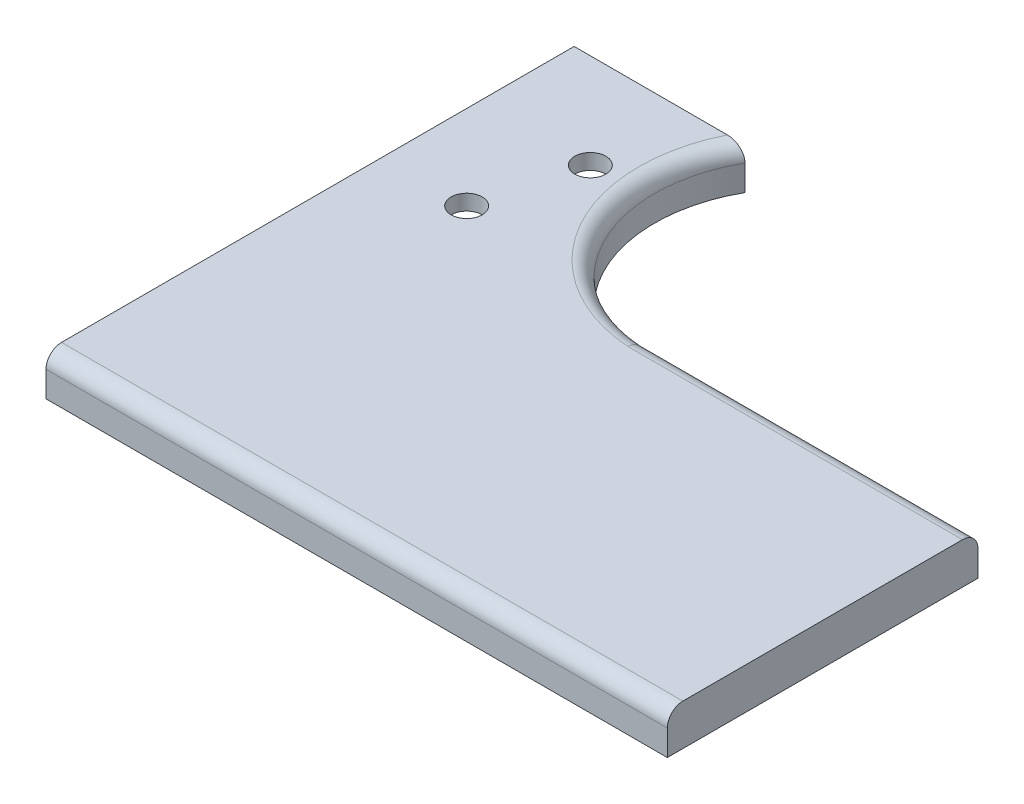
ISO-10303-21;
HEADER;
FILE_DESCRIPTION(('STEP AP214'),'2;1');
FILE_NAME('part.step','',(''),(''),'','','');
FILE_SCHEMA(('AUTOMOTIVE_DESIGN { 1 0 10303 214 1 1 1 1 }'));
ENDSEC;
DATA;
#1=APPLICATION_CONTEXT('core data for automotive mechanical design processes');
#2=APPLICATION_PROTOCOL_DEFINITION('international standard','automotive_design',2000,#1);
#3=PRODUCT_CONTEXT('',#1,'mechanical');
#4=PRODUCT('Part','Part','',(#3));
#5=PRODUCT_RELATED_PRODUCT_CATEGORY('part','',(#4));
#6=PRODUCT_DEFINITION_FORMATION('','',#4);
#7=PRODUCT_DEFINITION_CONTEXT('part definition',#1,'design');
#8=PRODUCT_DEFINITION('design','',#6,#7);
#9=PRODUCT_DEFINITION_SHAPE('','',#8);
#10=(LENGTH_UNIT() NAMED_UNIT(*) SI_UNIT(.MILLI.,.METRE.));
#11=(NAMED_UNIT(*) PLANE_ANGLE_UNIT() SI_UNIT($,.RADIAN.));
#12=(NAMED_UNIT(*) SI_UNIT($,.STERADIAN.) SOLID_ANGLE_UNIT());
#13=UNCERTAINTY_MEASURE_WITH_UNIT(LENGTH_MEASURE(1.E-05),#10,'distance_accuracy_value','');
#14=(GEOMETRIC_REPRESENTATION_CONTEXT(3) GLOBAL_UNCERTAINTY_ASSIGNED_CONTEXT((#13)) GLOBAL_UNIT_ASSIGNED_CONTEXT((#10,
#11,#12)) REPRESENTATION_CONTEXT('',''));
#15=CARTESIAN_POINT('',(0.,0.,0.));
#16=DIRECTION('',(0.,0.,1.));
#17=DIRECTION('',(1.,0.,0.));
#18=AXIS2_PLACEMENT_3D('',#15,#16,#17);
#19=CARTESIAN_POINT('',(20.,2.8,10.));
#20=DIRECTION('',(-1.,0.,0.));
#21=DIRECTION('',(0.,0.,1.));
#22=AXIS2_PLACEMENT_3D('',#19,#20,#21);
#23=PLANE('',#22);
#24=DIRECTION('',(0.,0.,-1.));
#25=VECTOR('',#24,1.);
#26=CARTESIAN_POINT('',(20.,2.8,10.));
#27=LINE('',#26,#25);
#28=CARTESIAN_POINT('',(20.,2.8,9.));
#29=VERTEX_POINT('',#28);
#30=CARTESIAN_POINT('',(20.,2.8,-9.));
#31=VERTEX_POINT('',#30);
#32=EDGE_CURVE('E192',#29,#31,#27,.T.);
#33=ORIENTED_EDGE('',*,*,#32,.F.);
#34=CARTESIAN_POINT('',(20.,1.8,9.));
#35=DIRECTION('',(-1.,0.,0.));
#36=DIRECTION('',(0.,0.,1.));
#37=AXIS2_PLACEMENT_3D('',#34,#35,#36);
#38=CIRCLE('',#37,1.);
#39=CARTESIAN_POINT('',(20.,1.8,10.));
#40=VERTEX_POINT('',#39);
#41=EDGE_CURVE('E64',#29,#40,#38,.F.);
#42=ORIENTED_EDGE('',*,*,#41,.T.);
#43=DIRECTION('',(0.,-1.,0.));
#44=VECTOR('',#43,1.);
#45=CARTESIAN_POINT('',(20.,2.8,10.));
#46=LINE('',#45,#44);
#47=CARTESIAN_POINT('',(20.,0.15,10.));
#48=VERTEX_POINT('',#47);
#49=EDGE_CURVE('E205',#40,#48,#46,.T.);
#50=ORIENTED_EDGE('',*,*,#49,.T.);
#51=DIRECTION('',(0.,0.,1.));
#52=VECTOR('',#51,1.);
#53=CARTESIAN_POINT('',(20.,0.15,10.));
#54=LINE('',#53,#52);
#55=CARTESIAN_POINT('',(20.,0.15,-10.));
#56=VERTEX_POINT('',#55);
#57=EDGE_CURVE('E449',#56,#48,#54,.T.);
#58=ORIENTED_EDGE('',*,*,#57,.F.);
#59=DIRECTION('',(0.,-1.,0.));
#60=VECTOR('',#59,1.);
#61=CARTESIAN_POINT('',(20.,2.8,-10.));
#62=LINE('',#61,#60);
#63=CARTESIAN_POINT('',(20.,1.8,-10.));
#64=VERTEX_POINT('',#63);
#65=EDGE_CURVE('E154',#64,#56,#62,.T.);
#66=ORIENTED_EDGE('',*,*,#65,.F.);
#67=CARTESIAN_POINT('',(20.,1.8,-9.));
#68=DIRECTION('',(-1.,0.,0.));
#69=DIRECTION('',(0.,0.,1.));
#70=AXIS2_PLACEMENT_3D('',#67,#68,#69);
#71=CIRCLE('',#70,1.);
#72=EDGE_CURVE('E251',#64,#31,#71,.F.);
#73=ORIENTED_EDGE('',*,*,#72,.T.);
#74=EDGE_LOOP('',(#33,#42,#50,#58,#66,#73));
#75=FACE_BOUND('',#74,.T.);
#76=ADVANCED_FACE('F39',(#75),#23,.F.);
#77=CARTESIAN_POINT('',(20.,2.8,-10.));
#78=DIRECTION('',(0.,0.,1.));
#79=DIRECTION('',(1.,0.,0.));
#80=AXIS2_PLACEMENT_3D('',#77,#78,#79);
#81=PLANE('',#80);
#82=DIRECTION('',(0.,-1.,0.));
#83=VECTOR('',#82,1.);
#84=CARTESIAN_POINT('',(-1.50000000000001,2.8,-10.));
#85=LINE('',#84,#83);
#86=CARTESIAN_POINT('',(-1.50000000000001,1.8,-10.));
#87=VERTEX_POINT('',#86);
#88=CARTESIAN_POINT('',(-1.50000000000001,0.15,-10.));
#89=VERTEX_POINT('',#88);
#90=EDGE_CURVE('E214',#87,#89,#85,.T.);
#91=ORIENTED_EDGE('',*,*,#90,.F.);
#92=DIRECTION('',(-1.,0.,0.));
#93=VECTOR('',#92,1.);
#94=CARTESIAN_POINT('',(20.,1.8,-10.));
#95=LINE('',#94,#93);
#96=EDGE_CURVE('E270',#87,#64,#95,.F.);
#97=ORIENTED_EDGE('',*,*,#96,.T.);
#98=ORIENTED_EDGE('',*,*,#65,.T.);
#99=DIRECTION('',(1.,0.,0.));
#100=VECTOR('',#99,1.);
#101=CARTESIAN_POINT('',(20.,0.15,-10.));
#102=LINE('',#101,#100);
#103=EDGE_CURVE('E448',#89,#56,#102,.T.);
#104=ORIENTED_EDGE('',*,*,#103,.F.);
#105=EDGE_LOOP('',(#91,#97,#98,#104));
#106=FACE_BOUND('',#105,.T.);
#107=ADVANCED_FACE('F245',(#106),#81,.F.);
#108=CARTESIAN_POINT('',(-0.800001347423966,2.8,-19.3839278495943));
#109=DIRECTION('',(0.,-1.,0.));
#110=DIRECTION('',(0.,0.,-1.));
#111=AXIS2_PLACEMENT_3D('',#108,#109,#110);
#112=CYLINDRICAL_SURFACE('',#111,9.41);
#113=DIRECTION('',(0.,-1.,0.));
#114=VECTOR('',#113,1.);
#115=CARTESIAN_POINT('',(-9.00000000000001,2.8,-24.));
#116=LINE('',#115,#114);
#117=CARTESIAN_POINT('',(-9.00000000000001,1.8,-24.));
#118=VERTEX_POINT('',#117);
#119=CARTESIAN_POINT('',(-9.00000000000001,0.15,-24.));
#120=VERTEX_POINT('',#119);
#121=EDGE_CURVE('E209',#118,#120,#116,.T.);
#122=ORIENTED_EDGE('',*,*,#121,.F.);
#123=CARTESIAN_POINT('',(-0.800001347423966,1.8,-19.3839278495943));
#124=DIRECTION('',(0.,1.,0.));
#125=DIRECTION('',(0.,0.,1.));
#126=AXIS2_PLACEMENT_3D('',#123,#124,#125);
#127=CIRCLE('',#126,9.41);
#128=EDGE_CURVE('E228',#118,#87,#127,.T.);
#129=ORIENTED_EDGE('',*,*,#128,.T.);
#130=ORIENTED_EDGE('',*,*,#90,.T.);
#131=CARTESIAN_POINT('',(-0.800001347423966,0.15,-19.3839278495943));
#132=DIRECTION('',(0.,-1.,0.));
#133=DIRECTION('',(0.,0.,-1.));
#134=AXIS2_PLACEMENT_3D('',#131,#132,#133);
#135=CIRCLE('',#134,9.41);
#136=EDGE_CURVE('E457',#120,#89,#135,.F.);
#137=ORIENTED_EDGE('',*,*,#136,.F.);
#138=EDGE_LOOP('',(#122,#129,#130,#137));
#139=FACE_BOUND('',#138,.T.);
#140=ADVANCED_FACE('F240',(#139),#112,.F.);
#141=CARTESIAN_POINT('',(-20.,2.8,-24.));
#142=DIRECTION('',(0.,0.,1.));
#143=DIRECTION('',(1.,0.,0.));
#144=AXIS2_PLACEMENT_3D('',#141,#142,#143);
#145=PLANE('',#144);
#146=DIRECTION('',(-1.,0.,0.));
#147=VECTOR('',#146,1.);
#148=CARTESIAN_POINT('',(-20.,2.8,-24.));
#149=LINE('',#148,#147);
#150=CARTESIAN_POINT('',(-10.1305949996119,2.8,-24.));
#151=VERTEX_POINT('',#150);
#152=CARTESIAN_POINT('',(-20.,2.8,-24.));
#153=VERTEX_POINT('',#152);
#154=EDGE_CURVE('E200',#151,#153,#149,.T.);
#155=ORIENTED_EDGE('',*,*,#154,.F.);
#156=CARTESIAN_POINT('',(-10.1305949996119,2.8,-24.));
#157=CARTESIAN_POINT('',(-10.0610613517426,2.80001355515933,-24.));
#158=CARTESIAN_POINT('',(-9.99152075106019,2.79417302842371,-24.));
#159=CARTESIAN_POINT('',(-9.85420158091561,2.7710100474746,-24.));
#160=CARTESIAN_POINT('',(-9.78642785292888,2.75365891534473,-24.));
#161=CARTESIAN_POINT('',(-9.65471364349504,2.70767823047388,-24.));
#162=CARTESIAN_POINT('',(-9.59077743840085,2.6790363552006,-24.));
#163=CARTESIAN_POINT('',(-9.46900083295921,2.61088817058653,-24.));
#164=CARTESIAN_POINT('',(-9.41115530050833,2.57139111099105,-24.));
#165=CARTESIAN_POINT('',(-9.30667458242885,2.48448906386137,-24.));
#166=CARTESIAN_POINT('',(-9.25961518668884,2.43759677088541,-24.));
#167=CARTESIAN_POINT('',(-9.17537083841592,2.33559211466166,-24.));
#168=CARTESIAN_POINT('',(-9.13818041776239,2.28048432993397,-24.));
#169=CARTESIAN_POINT('',(-9.07981201789184,2.17093191595679,-24.));
#170=CARTESIAN_POINT('',(-9.05722994377006,2.11723423957511,-24.));
#171=CARTESIAN_POINT('',(-9.02283234653028,2.00655922901478,-24.));
#172=CARTESIAN_POINT('',(-9.0109864936068,1.94959162024755,-24.));
#173=CARTESIAN_POINT('',(-9.00325254938776,1.87681292068836,-24.));
#174=CARTESIAN_POINT('',(-9.00203282838897,1.86146503735839,-24.));
#175=CARTESIAN_POINT('',(-9.0004078847212,1.83074728086677,-24.));
#176=CARTESIAN_POINT('',(-9.00000154792699,1.8153774666812,-24.));
#177=CARTESIAN_POINT('',(-9.00000000000001,1.8,-24.));
#178=B_SPLINE_CURVE_WITH_KNOTS('',3,(#156,#157,#158,#159,#160,#161,#162,#163,#164,#165,#166,
#167,#168,#169,#170,#171,#172,#173,#174,#175,#176,#177),.UNSPECIFIED.,.F.,.F.,(4,2,2,2,2,2,2,2,
2,2,4),(0.,0.208375333131006,0.417271779278609,0.626396845607646,0.835344265191601,
1.03351902756251,1.23158375653298,1.4053666153771,1.57865699370573,1.62483204734353,
1.67094380974593),.UNSPECIFIED.);
#179=EDGE_CURVE('E219',#151,#118,#178,.T.);
#180=ORIENTED_EDGE('',*,*,#179,.T.);
#181=ORIENTED_EDGE('',*,*,#121,.T.);
#182=DIRECTION('',(1.,0.,0.));
#183=VECTOR('',#182,1.);
#184=CARTESIAN_POINT('',(-20.,0.15,-24.));
#185=LINE('',#184,#183);
#186=CARTESIAN_POINT('',(-20.,0.15,-24.));
#187=VERTEX_POINT('',#186);
#188=EDGE_CURVE('E300',#187,#120,#185,.T.);
#189=ORIENTED_EDGE('',*,*,#188,.F.);
#190=DIRECTION('',(0.,-1.,0.));
#191=VECTOR('',#190,1.);
#192=CARTESIAN_POINT('',(-20.,2.8,-24.));
#193=LINE('',#192,#191);
#194=EDGE_CURVE('E207',#153,#187,#193,.T.);
#195=ORIENTED_EDGE('',*,*,#194,.F.);
#196=EDGE_LOOP('',(#155,#180,#181,#189,#195));
#197=FACE_BOUND('',#196,.T.);
#198=ADVANCED_FACE('F233',(#197),#145,.F.);
#199=CARTESIAN_POINT('',(-20.,2.8,10.));
#200=DIRECTION('',(1.,0.,0.));
#201=DIRECTION('',(0.,0.,-1.));
#202=AXIS2_PLACEMENT_3D('',#199,#200,#201);
#203=PLANE('',#202);
#204=DIRECTION('',(0.,-1.,0.));
#205=VECTOR('',#204,1.);
#206=CARTESIAN_POINT('',(-20.,2.8,10.));
#207=LINE('',#206,#205);
#208=CARTESIAN_POINT('',(-20.,1.8,10.));
#209=VERTEX_POINT('',#208);
#210=CARTESIAN_POINT('',(-20.,0.15,10.));
#211=VERTEX_POINT('',#210);
#212=EDGE_CURVE('E204',#209,#211,#207,.T.);
#213=ORIENTED_EDGE('',*,*,#212,.F.);
#214=CARTESIAN_POINT('',(-20.,1.8,9.));
#215=DIRECTION('',(1.,0.,0.));
#216=DIRECTION('',(0.,0.,-1.));
#217=AXIS2_PLACEMENT_3D('',#214,#215,#216);
#218=CIRCLE('',#217,1.);
#219=CARTESIAN_POINT('',(-20.,2.8,9.));
#220=VERTEX_POINT('',#219);
#221=EDGE_CURVE('E11',#209,#220,#218,.F.);
#222=ORIENTED_EDGE('',*,*,#221,.T.);
#223=DIRECTION('',(0.,0.,1.));
#224=VECTOR('',#223,1.);
#225=CARTESIAN_POINT('',(-20.,2.8,-10.));
#226=LINE('',#225,#224);
#227=EDGE_CURVE('E196',#153,#220,#226,.T.);
#228=ORIENTED_EDGE('',*,*,#227,.F.);
#229=ORIENTED_EDGE('',*,*,#194,.T.);
#230=DIRECTION('',(0.,0.,-1.));
#231=VECTOR('',#230,1.);
#232=CARTESIAN_POINT('',(-20.,0.15,10.));
#233=LINE('',#232,#231);
#234=EDGE_CURVE('E465',#211,#187,#233,.T.);
#235=ORIENTED_EDGE('',*,*,#234,.F.);
#236=EDGE_LOOP('',(#213,#222,#228,#229,#235));
#237=FACE_BOUND('',#236,.T.);
#238=ADVANCED_FACE('F236',(#237),#203,.F.);
#239=CARTESIAN_POINT('',(-20.,2.8,10.));
#240=DIRECTION('',(0.,0.,-1.));
#241=DIRECTION('',(-1.,0.,0.));
#242=AXIS2_PLACEMENT_3D('',#239,#240,#241);
#243=PLANE('',#242);
#244=ORIENTED_EDGE('',*,*,#49,.F.);
#245=DIRECTION('',(1.,0.,0.));
#246=VECTOR('',#245,1.);
#247=CARTESIAN_POINT('',(-20.,1.8,10.));
#248=LINE('',#247,#246);
#249=EDGE_CURVE('E50',#40,#209,#248,.F.);
#250=ORIENTED_EDGE('',*,*,#249,.T.);
#251=ORIENTED_EDGE('',*,*,#212,.T.);
#252=DIRECTION('',(-1.,0.,0.));
#253=VECTOR('',#252,1.);
#254=CARTESIAN_POINT('',(-20.,0.15,10.));
#255=LINE('',#254,#253);
#256=EDGE_CURVE('E165',#48,#211,#255,.T.);
#257=ORIENTED_EDGE('',*,*,#256,.F.);
#258=EDGE_LOOP('',(#244,#250,#251,#257));
#259=FACE_BOUND('',#258,.T.);
#260=ADVANCED_FACE('F311',(#259),#243,.F.);
#261=CARTESIAN_POINT('',(-0.800001347423966,2.8,-19.3839278495943));
#262=DIRECTION('',(0.,1.,0.));
#263=DIRECTION('',(0.,0.,1.));
#264=AXIS2_PLACEMENT_3D('',#261,#262,#263);
#265=PLANE('',#264);
#266=CARTESIAN_POINT('',(-14.5685216949524,2.8,-11.6501527120573));
#267=DIRECTION('',(0.,1.,0.));
#268=DIRECTION('',(0.,0.,1.));
#269=AXIS2_PLACEMENT_3D('',#266,#267,#268);
#270=CIRCLE('',#269,1.);
#271=CARTESIAN_POINT('',(-14.5685216949524,2.8,-10.6501527120573));
#272=VERTEX_POINT('',#271);
#273=EDGE_CURVE('E476',#272,#272,#270,.T.);
#274=ORIENTED_EDGE('',*,*,#273,.F.);
#275=EDGE_LOOP('',(#274));
#276=FACE_BOUND('',#275,.T.);
#277=CARTESIAN_POINT('',(-12.8572270569787,2.8,-17.9));
#278=DIRECTION('',(0.,1.,0.));
#279=DIRECTION('',(0.,0.,1.));
#280=AXIS2_PLACEMENT_3D('',#277,#278,#279);
#281=CIRCLE('',#280,1.);
#282=CARTESIAN_POINT('',(-12.8572270569787,2.8,-16.9));
#283=VERTEX_POINT('',#282);
#284=EDGE_CURVE('E475',#283,#283,#281,.T.);
#285=ORIENTED_EDGE('',*,*,#284,.F.);
#286=EDGE_LOOP('',(#285));
#287=FACE_BOUND('',#286,.T.);
#288=ORIENTED_EDGE('',*,*,#227,.T.);
#289=DIRECTION('',(1.,0.,0.));
#290=VECTOR('',#289,1.);
#291=CARTESIAN_POINT('',(20.,2.8,9.));
#292=LINE('',#291,#290);
#293=EDGE_CURVE('E262',#220,#29,#292,.T.);
#294=ORIENTED_EDGE('',*,*,#293,.T.);
#295=ORIENTED_EDGE('',*,*,#32,.T.);
#296=DIRECTION('',(-1.,0.,0.));
#297=VECTOR('',#296,1.);
#298=CARTESIAN_POINT('',(-1.50000000000001,2.8,-9.));
#299=LINE('',#298,#297);
#300=CARTESIAN_POINT('',(-1.53630455563376,2.8,-9.));
#301=VERTEX_POINT('',#300);
#302=EDGE_CURVE('E155',#31,#301,#299,.T.);
#303=ORIENTED_EDGE('',*,*,#302,.T.);
#304=CARTESIAN_POINT('',(-0.800001347423966,2.8,-19.3839278495943));
#305=DIRECTION('',(0.,1.,0.));
#306=DIRECTION('',(0.,0.,1.));
#307=AXIS2_PLACEMENT_3D('',#304,#305,#306);
#308=CIRCLE('',#307,10.41);
#309=EDGE_CURVE('E212',#301,#151,#308,.F.);
#310=ORIENTED_EDGE('',*,*,#309,.T.);
#311=ORIENTED_EDGE('',*,*,#154,.T.);
#312=EDGE_LOOP('',(#288,#294,#295,#303,#310,#311));
#313=FACE_BOUND('',#312,.T.);
#314=ADVANCED_FACE('F260',(#276,#287,#313),#265,.T.);
#315=CARTESIAN_POINT('',(0.,0.15,0.));
#316=DIRECTION('',(0.,-1.,0.));
#317=DIRECTION('',(0.,0.,-1.));
#318=AXIS2_PLACEMENT_3D('',#315,#316,#317);
#319=PLANE('',#318);
#320=DIRECTION('',(1.,0.,0.));
#321=VECTOR('',#320,1.);
#322=CARTESIAN_POINT('',(20.,0.15,-9.));
#323=LINE('',#322,#321);
#324=CARTESIAN_POINT('',(-1.53630455563376,0.15,-9.00000000000002));
#325=VERTEX_POINT('',#324);
#326=CARTESIAN_POINT('',(19.,0.15,-9.));
#327=VERTEX_POINT('',#326);
#328=EDGE_CURVE('E164',#325,#327,#323,.T.);
#329=ORIENTED_EDGE('',*,*,#328,.F.);
#330=CARTESIAN_POINT('',(-0.800001347423966,0.15,-19.3839278495943));
#331=DIRECTION('',(0.,-1.,0.));
#332=DIRECTION('',(0.,0.,-1.));
#333=AXIS2_PLACEMENT_3D('',#330,#331,#332);
#334=CIRCLE('',#333,10.41);
#335=CARTESIAN_POINT('',(-10.5617697427026,0.15,-23.));
#336=VERTEX_POINT('',#335);
#337=EDGE_CURVE('E467',#336,#325,#334,.F.);
#338=ORIENTED_EDGE('',*,*,#337,.F.);
#339=DIRECTION('',(1.,0.,0.));
#340=VECTOR('',#339,1.);
#341=CARTESIAN_POINT('',(-20.,0.15,-23.));
#342=LINE('',#341,#340);
#343=CARTESIAN_POINT('',(-19.,0.15,-23.));
#344=VERTEX_POINT('',#343);
#345=EDGE_CURVE('E469',#344,#336,#342,.T.);
#346=ORIENTED_EDGE('',*,*,#345,.F.);
#347=DIRECTION('',(0.,0.,-1.));
#348=VECTOR('',#347,1.);
#349=CARTESIAN_POINT('',(-19.,0.15,10.));
#350=LINE('',#349,#348);
#351=CARTESIAN_POINT('',(-19.,0.15,9.));
#352=VERTEX_POINT('',#351);
#353=EDGE_CURVE('E146',#352,#344,#350,.T.);
#354=ORIENTED_EDGE('',*,*,#353,.F.);
#355=DIRECTION('',(-1.,0.,0.));
#356=VECTOR('',#355,1.);
#357=CARTESIAN_POINT('',(-20.,0.15,9.));
#358=LINE('',#357,#356);
#359=CARTESIAN_POINT('',(19.,0.15,9.));
#360=VERTEX_POINT('',#359);
#361=EDGE_CURVE('E137',#360,#352,#358,.T.);
#362=ORIENTED_EDGE('',*,*,#361,.F.);
#363=DIRECTION('',(0.,0.,1.));
#364=VECTOR('',#363,1.);
#365=CARTESIAN_POINT('',(19.,0.15,10.));
#366=LINE('',#365,#364);
#367=EDGE_CURVE('E144',#327,#360,#366,.T.);
#368=ORIENTED_EDGE('',*,*,#367,.F.);
#369=EDGE_LOOP('',(#329,#338,#346,#354,#362,#368));
#370=FACE_BOUND('',#369,.T.);
#371=ORIENTED_EDGE('',*,*,#57,.T.);
#372=ORIENTED_EDGE('',*,*,#256,.T.);
#373=ORIENTED_EDGE('',*,*,#234,.T.);
#374=ORIENTED_EDGE('',*,*,#188,.T.);
#375=ORIENTED_EDGE('',*,*,#136,.T.);
#376=ORIENTED_EDGE('',*,*,#103,.T.);
#377=EDGE_LOOP('',(#371,#372,#373,#374,#375,#376));
#378=FACE_BOUND('',#377,.T.);
#379=ADVANCED_FACE('F145',(#370,#378),#319,.T.);
#380=CARTESIAN_POINT('',(-0.800001347423966,1.8,-19.3839278495943));
#381=DIRECTION('',(0.,1.,0.));
#382=DIRECTION('',(0.,0.,1.));
#383=AXIS2_PLACEMENT_3D('',#380,#381,#382);
#384=PLANE('',#383);
#385=CARTESIAN_POINT('',(-14.5685216949524,1.8,-11.6501527120573));
#386=DIRECTION('',(0.,-1.,0.));
#387=DIRECTION('',(0.,0.,-1.));
#388=AXIS2_PLACEMENT_3D('',#385,#386,#387);
#389=CIRCLE('',#388,1.);
#390=CARTESIAN_POINT('',(-14.5685216949524,1.8,-12.6501527120573));
#391=VERTEX_POINT('',#390);
#392=EDGE_CURVE('E279',#391,#391,#389,.T.);
#393=ORIENTED_EDGE('',*,*,#392,.F.);
#394=EDGE_LOOP('',(#393));
#395=FACE_BOUND('',#394,.T.);
#396=CARTESIAN_POINT('',(-12.8572270569787,1.8,-17.9));
#397=DIRECTION('',(0.,-1.,0.));
#398=DIRECTION('',(0.,0.,-1.));
#399=AXIS2_PLACEMENT_3D('',#396,#397,#398);
#400=CIRCLE('',#399,1.);
#401=CARTESIAN_POINT('',(-12.8572270569787,1.8,-18.9));
#402=VERTEX_POINT('',#401);
#403=EDGE_CURVE('E477',#402,#402,#400,.T.);
#404=ORIENTED_EDGE('',*,*,#403,.F.);
#405=EDGE_LOOP('',(#404));
#406=FACE_BOUND('',#405,.T.);
#407=DIRECTION('',(0.,0.,-1.));
#408=VECTOR('',#407,1.);
#409=CARTESIAN_POINT('',(19.,1.8,10.));
#410=LINE('',#409,#408);
#411=CARTESIAN_POINT('',(19.,1.8,9.));
#412=VERTEX_POINT('',#411);
#413=CARTESIAN_POINT('',(19.,1.8,-9.));
#414=VERTEX_POINT('',#413);
#415=EDGE_CURVE('E178',#412,#414,#410,.T.);
#416=ORIENTED_EDGE('',*,*,#415,.F.);
#417=DIRECTION('',(1.,0.,0.));
#418=VECTOR('',#417,1.);
#419=CARTESIAN_POINT('',(-20.,1.8,9.));
#420=LINE('',#419,#418);
#421=CARTESIAN_POINT('',(-19.,1.8,9.));
#422=VERTEX_POINT('',#421);
#423=EDGE_CURVE('E169',#422,#412,#420,.T.);
#424=ORIENTED_EDGE('',*,*,#423,.F.);
#425=DIRECTION('',(0.,0.,1.));
#426=VECTOR('',#425,1.);
#427=CARTESIAN_POINT('',(-19.,1.8,10.));
#428=LINE('',#427,#426);
#429=CARTESIAN_POINT('',(-19.,1.8,-23.));
#430=VERTEX_POINT('',#429);
#431=EDGE_CURVE('E172',#430,#422,#428,.T.);
#432=ORIENTED_EDGE('',*,*,#431,.F.);
#433=DIRECTION('',(-1.,0.,0.));
#434=VECTOR('',#433,1.);
#435=CARTESIAN_POINT('',(-20.,1.8,-23.));
#436=LINE('',#435,#434);
#437=CARTESIAN_POINT('',(-10.5617697427026,1.8,-23.));
#438=VERTEX_POINT('',#437);
#439=EDGE_CURVE('E188',#438,#430,#436,.T.);
#440=ORIENTED_EDGE('',*,*,#439,.F.);
#441=CARTESIAN_POINT('',(-0.800001347423966,1.8,-19.3839278495943));
#442=DIRECTION('',(0.,1.,0.));
#443=DIRECTION('',(0.,0.,1.));
#444=AXIS2_PLACEMENT_3D('',#441,#442,#443);
#445=CIRCLE('',#444,10.41);
#446=CARTESIAN_POINT('',(-1.53630455563376,1.8,-9.));
#447=VERTEX_POINT('',#446);
#448=EDGE_CURVE('E187',#447,#438,#445,.F.);
#449=ORIENTED_EDGE('',*,*,#448,.F.);
#450=DIRECTION('',(-1.,0.,0.));
#451=VECTOR('',#450,1.);
#452=CARTESIAN_POINT('',(20.,1.8,-9.));
#453=LINE('',#452,#451);
#454=EDGE_CURVE('E183',#414,#447,#453,.T.);
#455=ORIENTED_EDGE('',*,*,#454,.F.);
#456=EDGE_LOOP('',(#416,#424,#432,#440,#449,#455));
#457=FACE_BOUND('',#456,.T.);
#458=ADVANCED_FACE('F346',(#395,#406,#457),#384,.F.);
#459=CARTESIAN_POINT('',(-20.,2.8,9.));
#460=DIRECTION('',(0.,0.,-1.));
#461=DIRECTION('',(-1.,0.,0.));
#462=AXIS2_PLACEMENT_3D('',#459,#460,#461);
#463=PLANE('',#462);
#464=DIRECTION('',(0.,-1.,0.));
#465=VECTOR('',#464,1.);
#466=CARTESIAN_POINT('',(19.,2.8,9.));
#467=LINE('',#466,#465);
#468=EDGE_CURVE('E157',#412,#360,#467,.T.);
#469=ORIENTED_EDGE('',*,*,#468,.T.);
#470=ORIENTED_EDGE('',*,*,#361,.T.);
#471=DIRECTION('',(0.,-1.,0.));
#472=VECTOR('',#471,1.);
#473=CARTESIAN_POINT('',(-19.,2.8,9.));
#474=LINE('',#473,#472);
#475=EDGE_CURVE('E167',#422,#352,#474,.T.);
#476=ORIENTED_EDGE('',*,*,#475,.F.);
#477=ORIENTED_EDGE('',*,*,#423,.T.);
#478=EDGE_LOOP('',(#469,#470,#476,#477));
#479=FACE_BOUND('',#478,.T.);
#480=ADVANCED_FACE('F170',(#479),#463,.T.);
#481=CARTESIAN_POINT('',(-19.,2.8,10.));
#482=DIRECTION('',(1.,0.,0.));
#483=DIRECTION('',(0.,0.,-1.));
#484=AXIS2_PLACEMENT_3D('',#481,#482,#483);
#485=PLANE('',#484);
#486=ORIENTED_EDGE('',*,*,#475,.T.);
#487=ORIENTED_EDGE('',*,*,#353,.T.);
#488=DIRECTION('',(0.,-1.,0.));
#489=VECTOR('',#488,1.);
#490=CARTESIAN_POINT('',(-19.,2.8,-23.));
#491=LINE('',#490,#489);
#492=EDGE_CURVE('E175',#430,#344,#491,.T.);
#493=ORIENTED_EDGE('',*,*,#492,.F.);
#494=ORIENTED_EDGE('',*,*,#431,.T.);
#495=EDGE_LOOP('',(#486,#487,#493,#494));
#496=FACE_BOUND('',#495,.T.);
#497=ADVANCED_FACE('F415',(#496),#485,.T.);
#498=CARTESIAN_POINT('',(-20.,2.8,-23.));
#499=DIRECTION('',(0.,0.,1.));
#500=DIRECTION('',(1.,0.,0.));
#501=AXIS2_PLACEMENT_3D('',#498,#499,#500);
#502=PLANE('',#501);
#503=ORIENTED_EDGE('',*,*,#492,.T.);
#504=ORIENTED_EDGE('',*,*,#345,.T.);
#505=DIRECTION('',(0.,-1.,0.));
#506=VECTOR('',#505,1.);
#507=CARTESIAN_POINT('',(-10.5617697427026,1.8,-23.));
#508=LINE('',#507,#506);
#509=EDGE_CURVE('E182',#438,#336,#508,.T.);
#510=ORIENTED_EDGE('',*,*,#509,.F.);
#511=ORIENTED_EDGE('',*,*,#439,.T.);
#512=EDGE_LOOP('',(#503,#504,#510,#511));
#513=FACE_BOUND('',#512,.T.);
#514=ADVANCED_FACE('F404',(#513),#502,.T.);
#515=CARTESIAN_POINT('',(-0.800001347423966,2.8,-19.3839278495943));
#516=DIRECTION('',(0.,-1.,0.));
#517=DIRECTION('',(0.,0.,-1.));
#518=AXIS2_PLACEMENT_3D('',#515,#516,#517);
#519=CYLINDRICAL_SURFACE('',#518,10.41);
#520=ORIENTED_EDGE('',*,*,#509,.T.);
#521=ORIENTED_EDGE('',*,*,#337,.T.);
#522=DIRECTION('',(0.,-1.,0.));
#523=VECTOR('',#522,1.);
#524=CARTESIAN_POINT('',(-1.53630455563376,1.8,-9.));
#525=LINE('',#524,#523);
#526=EDGE_CURVE('E179',#447,#325,#525,.T.);
#527=ORIENTED_EDGE('',*,*,#526,.F.);
#528=ORIENTED_EDGE('',*,*,#448,.T.);
#529=EDGE_LOOP('',(#520,#521,#527,#528));
#530=FACE_BOUND('',#529,.T.);
#531=ADVANCED_FACE('F398',(#530),#519,.T.);
#532=CARTESIAN_POINT('',(20.,2.8,-9.));
#533=DIRECTION('',(0.,0.,1.));
#534=DIRECTION('',(1.,0.,0.));
#535=AXIS2_PLACEMENT_3D('',#532,#533,#534);
#536=PLANE('',#535);
#537=ORIENTED_EDGE('',*,*,#526,.T.);
#538=ORIENTED_EDGE('',*,*,#328,.T.);
#539=DIRECTION('',(0.,-1.,0.));
#540=VECTOR('',#539,1.);
#541=CARTESIAN_POINT('',(19.,2.8,-9.));
#542=LINE('',#541,#540);
#543=EDGE_CURVE('E161',#414,#327,#542,.T.);
#544=ORIENTED_EDGE('',*,*,#543,.F.);
#545=ORIENTED_EDGE('',*,*,#454,.T.);
#546=EDGE_LOOP('',(#537,#538,#544,#545));
#547=FACE_BOUND('',#546,.T.);
#548=ADVANCED_FACE('F387',(#547),#536,.T.);
#549=CARTESIAN_POINT('',(19.,2.8,10.));
#550=DIRECTION('',(-1.,0.,0.));
#551=DIRECTION('',(0.,0.,1.));
#552=AXIS2_PLACEMENT_3D('',#549,#550,#551);
#553=PLANE('',#552);
#554=ORIENTED_EDGE('',*,*,#543,.T.);
#555=ORIENTED_EDGE('',*,*,#367,.T.);
#556=ORIENTED_EDGE('',*,*,#468,.F.);
#557=ORIENTED_EDGE('',*,*,#415,.T.);
#558=EDGE_LOOP('',(#554,#555,#556,#557));
#559=FACE_BOUND('',#558,.T.);
#560=ADVANCED_FACE('F156',(#559),#553,.T.);
#561=CARTESIAN_POINT('',(-12.8572270569787,11.8,-17.9));
#562=DIRECTION('',(0.,-1.,0.));
#563=DIRECTION('',(0.,0.,-1.));
#564=AXIS2_PLACEMENT_3D('',#561,#562,#563);
#565=CYLINDRICAL_SURFACE('',#564,1.);
#566=ORIENTED_EDGE('',*,*,#284,.T.);
#567=EDGE_LOOP('',(#566));
#568=FACE_BOUND('',#567,.T.);
#569=ORIENTED_EDGE('',*,*,#403,.T.);
#570=EDGE_LOOP('',(#569));
#571=FACE_BOUND('',#570,.T.);
#572=ADVANCED_FACE('F288',(#568,#571),#565,.F.);
#573=CARTESIAN_POINT('',(-14.5685216949524,11.8,-11.6501527120573));
#574=DIRECTION('',(0.,-1.,0.));
#575=DIRECTION('',(0.,0.,-1.));
#576=AXIS2_PLACEMENT_3D('',#573,#574,#575);
#577=CYLINDRICAL_SURFACE('',#576,1.);
#578=ORIENTED_EDGE('',*,*,#273,.T.);
#579=EDGE_LOOP('',(#578));
#580=FACE_BOUND('',#579,.T.);
#581=ORIENTED_EDGE('',*,*,#392,.T.);
#582=EDGE_LOOP('',(#581));
#583=FACE_BOUND('',#582,.T.);
#584=ADVANCED_FACE('F277',(#580,#583),#577,.F.);
#585=CARTESIAN_POINT('',(-0.800001347423966,1.8,-9.));
#586=DIRECTION('',(1.,0.,0.));
#587=DIRECTION('',(0.,0.,-1.));
#588=AXIS2_PLACEMENT_3D('',#585,#586,#587);
#589=CYLINDRICAL_SURFACE('',#588,1.);
#590=ORIENTED_EDGE('',*,*,#72,.F.);
#591=ORIENTED_EDGE('',*,*,#96,.F.);
#592=CARTESIAN_POINT('',(-1.50000000000001,1.8,-10.));
#593=CARTESIAN_POINT('',(-1.49999999299599,1.82811981688478,-9.99999982267368));
#594=CARTESIAN_POINT('',(-1.50004420618369,1.85622615622795,-9.99881316862947));
#595=CARTESIAN_POINT('',(-1.50022049996358,1.91223761442953,-9.9940791912072));
#596=CARTESIAN_POINT('',(-1.50035257622538,1.94014274313625,-9.99053198417074));
#597=CARTESIAN_POINT('',(-1.50087918463756,2.02321043033788,-9.97638288640053));
#598=CARTESIAN_POINT('',(-1.50140410049083,2.0778163511996,-9.96227342820537));
#599=CARTESIAN_POINT('',(-1.50278473315008,2.18388064319215,-9.92509434000455));
#600=CARTESIAN_POINT('',(-1.50364060577994,2.23533751842419,-9.90202048928287));
#601=CARTESIAN_POINT('',(-1.50565514945299,2.33364147952607,-9.84757366440662));
#602=CARTESIAN_POINT('',(-1.50681374892075,2.38048965145851,-9.81620265197565));
#603=CARTESIAN_POINT('',(-1.5093969906453,2.468264930021,-9.74604316603908));
#604=CARTESIAN_POINT('',(-1.51082170131474,2.50919050924086,-9.70725278507854));
#605=CARTESIAN_POINT('',(-1.51389275014466,2.58396468872042,-9.6233439061085));
#606=CARTESIAN_POINT('',(-1.51553916820068,2.6178107264837,-9.57822312659973));
#607=CARTESIAN_POINT('',(-1.51900380716251,2.67747731812498,-9.48290761574934));
#608=CARTESIAN_POINT('',(-1.52082219235847,2.70329009428171,-9.43270802906881));
#609=CARTESIAN_POINT('',(-1.52457382453149,2.74609740317025,-9.328715569214));
#610=CARTESIAN_POINT('',(-1.52650695618797,2.7631006277279,-9.27492629714548));
#611=CARTESIAN_POINT('',(-1.52962206981325,2.78274866243522,-9.18788937568027));
#612=CARTESIAN_POINT('',(-1.53078600376792,2.78842267999661,-9.15529158580529));
#613=CARTESIAN_POINT('',(-1.53312147878569,2.79651230974581,-9.08972493403434));
#614=CARTESIAN_POINT('',(-1.53429300667498,2.79893254478208,-9.05675666584261));
#615=CARTESIAN_POINT('',(-1.53574335387876,2.79990604142511,-9.01584438444639));
#616=CARTESIAN_POINT('',(-1.53602405825713,2.8000002536278,-9.00792155420097));
#617=CARTESIAN_POINT('',(-1.53630455563352,2.8,-9.));
#618=B_SPLINE_CURVE_WITH_KNOTS('',3,(#592,#593,#594,#595,#596,#597,#598,#599,#600,#601,#602,
#603,#604,#605,#606,#607,#608,#609,#610,#611,#612,#613,#614,#615,#616,#617),.UNSPECIFIED.,.F.,
.F.,(4,2,2,2,2,2,2,2,2,2,2,2,4),(0.,0.0843076172968083,0.168611079737923,0.336948298948265,
0.505364872820668,0.673741662982586,0.84216179967594,1.01064279229048,1.17928640261105,
1.34776330459295,1.44695118635533,1.54599799635435,1.5697805039642),.UNSPECIFIED.);
#619=EDGE_CURVE('E267',#301,#87,#618,.F.);
#620=ORIENTED_EDGE('',*,*,#619,.F.);
#621=ORIENTED_EDGE('',*,*,#302,.F.);
#622=EDGE_LOOP('',(#590,#591,#620,#621));
#623=FACE_BOUND('',#622,.T.);
#624=ADVANCED_FACE('F276',(#623),#589,.T.);
#625=CARTESIAN_POINT('',(-0.800001347423966,1.8,-19.3839278495943));
#626=DIRECTION('',(0.,1.,0.));
#627=DIRECTION('',(0.,0.,1.));
#628=AXIS2_PLACEMENT_3D('',#625,#626,#627);
#629=TOROIDAL_SURFACE('',#628,10.41,1.);
#630=ORIENTED_EDGE('',*,*,#619,.T.);
#631=ORIENTED_EDGE('',*,*,#128,.F.);
#632=ORIENTED_EDGE('',*,*,#179,.F.);
#633=ORIENTED_EDGE('',*,*,#309,.F.);
#634=EDGE_LOOP('',(#630,#631,#632,#633));
#635=FACE_BOUND('',#634,.T.);
#636=ADVANCED_FACE('F226',(#635),#629,.T.);
#637=CARTESIAN_POINT('',(-0.800001347423966,1.8,9.));
#638=DIRECTION('',(-1.,0.,0.));
#639=DIRECTION('',(0.,0.,1.));
#640=AXIS2_PLACEMENT_3D('',#637,#638,#639);
#641=CYLINDRICAL_SURFACE('',#640,1.);
#642=ORIENTED_EDGE('',*,*,#221,.F.);
#643=ORIENTED_EDGE('',*,*,#249,.F.);
#644=ORIENTED_EDGE('',*,*,#41,.F.);
#645=ORIENTED_EDGE('',*,*,#293,.F.);
#646=EDGE_LOOP('',(#642,#643,#644,#645));
#647=FACE_BOUND('',#646,.T.);
#648=ADVANCED_FACE('F41',(#647),#641,.T.);
#649=CLOSED_SHELL('',(#76,#107,#140,#198,#238,#260,#314,#379,#458,#480,#497,#514,#531,#548,#560,
#572,#584,#624,#636,#648));
#650=MANIFOLD_SOLID_BREP('B2',#649);
#651=ADVANCED_BREP_SHAPE_REPRESENTATION('',(#18,#650),#14);
#652=SHAPE_DEFINITION_REPRESENTATION(#9,#651);
ENDSEC;
END-ISO-10303-21;
